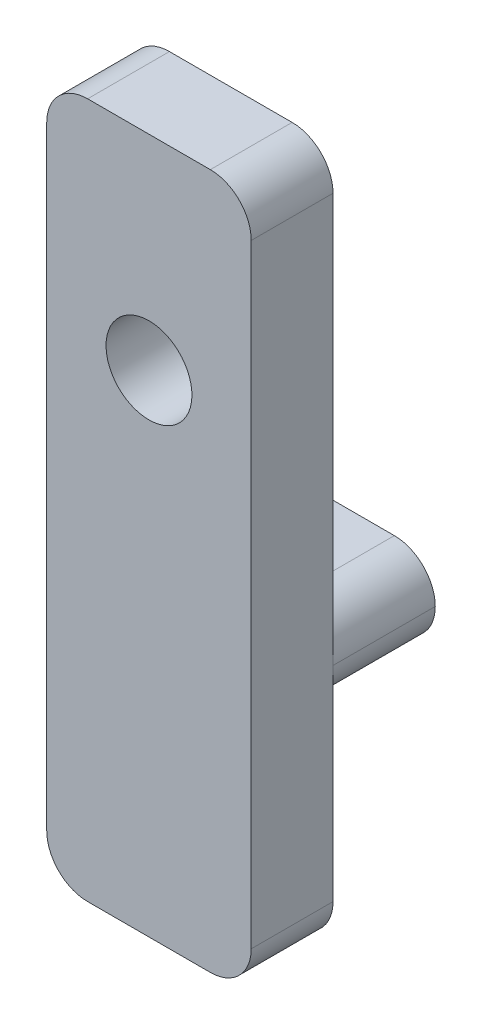
ISO-10303-21;
HEADER;
FILE_DESCRIPTION(('STEP AP214'),'2;1');
FILE_NAME('part.step','',(''),(''),'','','');
FILE_SCHEMA(('AUTOMOTIVE_DESIGN { 1 0 10303 214 1 1 1 1 }'));
ENDSEC;
DATA;
#1=APPLICATION_CONTEXT('core data for automotive mechanical design processes');
#2=APPLICATION_PROTOCOL_DEFINITION('international standard','automotive_design',2000,#1);
#3=PRODUCT_CONTEXT('',#1,'mechanical');
#4=PRODUCT('Part','Part','',(#3));
#5=PRODUCT_RELATED_PRODUCT_CATEGORY('part','',(#4));
#6=PRODUCT_DEFINITION_FORMATION('','',#4);
#7=PRODUCT_DEFINITION_CONTEXT('part definition',#1,'design');
#8=PRODUCT_DEFINITION('design','',#6,#7);
#9=PRODUCT_DEFINITION_SHAPE('','',#8);
#10=(LENGTH_UNIT() NAMED_UNIT(*) SI_UNIT(.MILLI.,.METRE.));
#11=(NAMED_UNIT(*) PLANE_ANGLE_UNIT() SI_UNIT($,.RADIAN.));
#12=(NAMED_UNIT(*) SI_UNIT($,.STERADIAN.) SOLID_ANGLE_UNIT());
#13=UNCERTAINTY_MEASURE_WITH_UNIT(LENGTH_MEASURE(1.E-05),#10,'distance_accuracy_value','');
#14=(GEOMETRIC_REPRESENTATION_CONTEXT(3) GLOBAL_UNCERTAINTY_ASSIGNED_CONTEXT((#13)) GLOBAL_UNIT_ASSIGNED_CONTEXT((#10,
#11,#12)) REPRESENTATION_CONTEXT('',''));
#15=CARTESIAN_POINT('',(0.,0.,0.));
#16=DIRECTION('',(0.,0.,1.));
#17=DIRECTION('',(1.,0.,0.));
#18=AXIS2_PLACEMENT_3D('',#15,#16,#17);
#19=CARTESIAN_POINT('',(5.,-10.,-4.));
#20=DIRECTION('',(0.,1.,0.));
#21=DIRECTION('',(0.,0.,1.));
#22=AXIS2_PLACEMENT_3D('',#19,#20,#21);
#23=PLANE('',#22);
#24=DIRECTION('',(-1.,0.,0.));
#25=VECTOR('',#24,1.);
#26=CARTESIAN_POINT('',(5.,-10.,0.));
#27=LINE('',#26,#25);
#28=CARTESIAN_POINT('',(3.,-10.,0.));
#29=VERTEX_POINT('',#28);
#30=CARTESIAN_POINT('',(-3.,-10.,0.));
#31=VERTEX_POINT('',#30);
#32=EDGE_CURVE('E164',#29,#31,#27,.T.);
#33=ORIENTED_EDGE('',*,*,#32,.T.);
#34=DIRECTION('',(0.,0.,-1.));
#35=VECTOR('',#34,1.);
#36=CARTESIAN_POINT('',(-3.,-10.,-4.));
#37=LINE('',#36,#35);
#38=CARTESIAN_POINT('',(-3.,-10.,-4.));
#39=VERTEX_POINT('',#38);
#40=EDGE_CURVE('E211',#31,#39,#37,.T.);
#41=ORIENTED_EDGE('',*,*,#40,.T.);
#42=DIRECTION('',(-1.,0.,0.));
#43=VECTOR('',#42,1.);
#44=CARTESIAN_POINT('',(5.,-10.,-4.));
#45=LINE('',#44,#43);
#46=CARTESIAN_POINT('',(3.,-10.,-4.));
#47=VERTEX_POINT('',#46);
#48=EDGE_CURVE('E168',#47,#39,#45,.T.);
#49=ORIENTED_EDGE('',*,*,#48,.F.);
#50=DIRECTION('',(0.,0.,-1.));
#51=VECTOR('',#50,1.);
#52=CARTESIAN_POINT('',(3.,-10.,-4.));
#53=LINE('',#52,#51);
#54=EDGE_CURVE('E209',#47,#29,#53,.F.);
#55=ORIENTED_EDGE('',*,*,#54,.T.);
#56=EDGE_LOOP('',(#33,#41,#49,#55));
#57=FACE_BOUND('',#56,.T.);
#58=ADVANCED_FACE('F35',(#57),#23,.F.);
#59=CARTESIAN_POINT('',(5.,0.,-4.));
#60=DIRECTION('',(0.,0.,1.));
#61=DIRECTION('',(0.,-1.,0.));
#62=AXIS2_PLACEMENT_3D('',#59,#60,#61);
#63=PLANE('',#62);
#64=ORIENTED_EDGE('',*,*,#48,.T.);
#65=CARTESIAN_POINT('',(-3.,-8.00000000000001,-4.));
#66=DIRECTION('',(0.,0.,1.));
#67=DIRECTION('',(0.,-1.,0.));
#68=AXIS2_PLACEMENT_3D('',#65,#66,#67);
#69=CIRCLE('',#68,2.);
#70=CARTESIAN_POINT('',(-5.,-8.00000000000001,-4.));
#71=VERTEX_POINT('',#70);
#72=EDGE_CURVE('E52',#39,#71,#69,.F.);
#73=ORIENTED_EDGE('',*,*,#72,.T.);
#74=DIRECTION('',(0.,1.,0.));
#75=VECTOR('',#74,1.);
#76=CARTESIAN_POINT('',(-5.,0.,-4.));
#77=LINE('',#76,#75);
#78=CARTESIAN_POINT('',(-5.,1.99999999999999,-4.));
#79=VERTEX_POINT('',#78);
#80=EDGE_CURVE('E222',#71,#79,#77,.T.);
#81=ORIENTED_EDGE('',*,*,#80,.T.);
#82=CARTESIAN_POINT('',(-3.,2.,-4.));
#83=DIRECTION('',(0.,0.,1.));
#84=DIRECTION('',(0.,-1.,0.));
#85=AXIS2_PLACEMENT_3D('',#82,#83,#84);
#86=CIRCLE('',#85,2.);
#87=CARTESIAN_POINT('',(-3.,0.,-4.));
#88=VERTEX_POINT('',#87);
#89=EDGE_CURVE('E215',#79,#88,#86,.T.);
#90=ORIENTED_EDGE('',*,*,#89,.T.);
#91=DIRECTION('',(-1.,0.,0.));
#92=VECTOR('',#91,1.);
#93=CARTESIAN_POINT('',(5.,0.,-4.));
#94=LINE('',#93,#92);
#95=CARTESIAN_POINT('',(3.,0.,-4.));
#96=VERTEX_POINT('',#95);
#97=EDGE_CURVE('E159',#96,#88,#94,.T.);
#98=ORIENTED_EDGE('',*,*,#97,.F.);
#99=CARTESIAN_POINT('',(3.,2.,-4.));
#100=DIRECTION('',(0.,0.,1.));
#101=DIRECTION('',(0.,-1.,0.));
#102=AXIS2_PLACEMENT_3D('',#99,#100,#101);
#103=CIRCLE('',#102,2.);
#104=CARTESIAN_POINT('',(5.,2.,-4.));
#105=VERTEX_POINT('',#104);
#106=EDGE_CURVE('E11',#96,#105,#103,.T.);
#107=ORIENTED_EDGE('',*,*,#106,.T.);
#108=DIRECTION('',(0.,1.,0.));
#109=VECTOR('',#108,1.);
#110=CARTESIAN_POINT('',(5.,0.,-4.));
#111=LINE('',#110,#109);
#112=CARTESIAN_POINT('',(5.,-8.00000000000001,-4.));
#113=VERTEX_POINT('',#112);
#114=EDGE_CURVE('E243',#113,#105,#111,.T.);
#115=ORIENTED_EDGE('',*,*,#114,.F.);
#116=CARTESIAN_POINT('',(3.,-8.00000000000001,-4.));
#117=DIRECTION('',(0.,0.,1.));
#118=DIRECTION('',(0.,-1.,0.));
#119=AXIS2_PLACEMENT_3D('',#116,#117,#118);
#120=CIRCLE('',#119,2.);
#121=EDGE_CURVE('E60',#113,#47,#120,.F.);
#122=ORIENTED_EDGE('',*,*,#121,.T.);
#123=EDGE_LOOP('',(#64,#73,#81,#90,#98,#107,#115,#122));
#124=FACE_BOUND('',#123,.T.);
#125=ADVANCED_FACE('F264',(#124),#63,.F.);
#126=CARTESIAN_POINT('',(5.,0.,-9.00000000000001));
#127=DIRECTION('',(0.,1.,0.));
#128=DIRECTION('',(0.,0.,1.));
#129=AXIS2_PLACEMENT_3D('',#126,#127,#128);
#130=PLANE('',#129);
#131=ORIENTED_EDGE('',*,*,#97,.T.);
#132=DIRECTION('',(0.,0.,-1.));
#133=VECTOR('',#132,1.);
#134=CARTESIAN_POINT('',(-3.,0.,-9.00000000000001));
#135=LINE('',#134,#133);
#136=CARTESIAN_POINT('',(-3.,0.,-9.00000000000001));
#137=VERTEX_POINT('',#136);
#138=EDGE_CURVE('E150',#88,#137,#135,.T.);
#139=ORIENTED_EDGE('',*,*,#138,.T.);
#140=DIRECTION('',(-1.,0.,0.));
#141=VECTOR('',#140,1.);
#142=CARTESIAN_POINT('',(5.,0.,-9.00000000000001));
#143=LINE('',#142,#141);
#144=CARTESIAN_POINT('',(3.,0.,-9.00000000000001));
#145=VERTEX_POINT('',#144);
#146=EDGE_CURVE('E143',#145,#137,#143,.T.);
#147=ORIENTED_EDGE('',*,*,#146,.F.);
#148=DIRECTION('',(0.,0.,-1.));
#149=VECTOR('',#148,1.);
#150=CARTESIAN_POINT('',(3.,0.,-9.00000000000001));
#151=LINE('',#150,#149);
#152=EDGE_CURVE('E156',#145,#96,#151,.F.);
#153=ORIENTED_EDGE('',*,*,#152,.T.);
#154=EDGE_LOOP('',(#131,#139,#147,#153));
#155=FACE_BOUND('',#154,.T.);
#156=ADVANCED_FACE('F155',(#155),#130,.F.);
#157=CARTESIAN_POINT('',(5.,4.,-9.));
#158=DIRECTION('',(0.,0.,1.));
#159=DIRECTION('',(0.,-1.,0.));
#160=AXIS2_PLACEMENT_3D('',#157,#158,#159);
#161=PLANE('',#160);
#162=ORIENTED_EDGE('',*,*,#146,.T.);
#163=CARTESIAN_POINT('',(-3.,2.,-9.00000000000001));
#164=DIRECTION('',(0.,0.,1.));
#165=DIRECTION('',(0.,-1.,0.));
#166=AXIS2_PLACEMENT_3D('',#163,#164,#165);
#167=CIRCLE('',#166,2.);
#168=CARTESIAN_POINT('',(-5.,2.,-9.00000000000001));
#169=VERTEX_POINT('',#168);
#170=EDGE_CURVE('E175',#137,#169,#167,.F.);
#171=ORIENTED_EDGE('',*,*,#170,.T.);
#172=CARTESIAN_POINT('',(-3.,2.,-9.00000000000001));
#173=DIRECTION('',(0.,0.,1.));
#174=DIRECTION('',(0.,-1.,0.));
#175=AXIS2_PLACEMENT_3D('',#172,#173,#174);
#176=CIRCLE('',#175,2.);
#177=CARTESIAN_POINT('',(-3.,4.,-9.));
#178=VERTEX_POINT('',#177);
#179=EDGE_CURVE('E173',#169,#178,#176,.F.);
#180=ORIENTED_EDGE('',*,*,#179,.T.);
#181=DIRECTION('',(-1.,0.,0.));
#182=VECTOR('',#181,1.);
#183=CARTESIAN_POINT('',(5.,4.,-9.));
#184=LINE('',#183,#182);
#185=CARTESIAN_POINT('',(3.,4.,-9.));
#186=VERTEX_POINT('',#185);
#187=EDGE_CURVE('E160',#186,#178,#184,.T.);
#188=ORIENTED_EDGE('',*,*,#187,.F.);
#189=CARTESIAN_POINT('',(3.,2.,-9.00000000000001));
#190=DIRECTION('',(0.,0.,1.));
#191=DIRECTION('',(0.,-1.,0.));
#192=AXIS2_PLACEMENT_3D('',#189,#190,#191);
#193=CIRCLE('',#192,2.);
#194=CARTESIAN_POINT('',(5.,2.,-9.00000000000001));
#195=VERTEX_POINT('',#194);
#196=EDGE_CURVE('E145',#186,#195,#193,.F.);
#197=ORIENTED_EDGE('',*,*,#196,.T.);
#198=CARTESIAN_POINT('',(3.,2.,-9.00000000000001));
#199=DIRECTION('',(0.,0.,1.));
#200=DIRECTION('',(0.,-1.,0.));
#201=AXIS2_PLACEMENT_3D('',#198,#199,#200);
#202=CIRCLE('',#201,2.);
#203=EDGE_CURVE('E140',#195,#145,#202,.F.);
#204=ORIENTED_EDGE('',*,*,#203,.T.);
#205=EDGE_LOOP('',(#162,#171,#180,#188,#197,#204));
#206=FACE_BOUND('',#205,.T.);
#207=ADVANCED_FACE('F142',(#206),#161,.F.);
#208=CARTESIAN_POINT('',(5.,4.,-4.));
#209=DIRECTION('',(0.,-1.,0.));
#210=DIRECTION('',(0.,0.,-1.));
#211=AXIS2_PLACEMENT_3D('',#208,#209,#210);
#212=PLANE('',#211);
#213=ORIENTED_EDGE('',*,*,#187,.T.);
#214=DIRECTION('',(0.,0.,1.));
#215=VECTOR('',#214,1.);
#216=CARTESIAN_POINT('',(-3.,4.,-4.));
#217=LINE('',#216,#215);
#218=CARTESIAN_POINT('',(-3.,4.,-4.));
#219=VERTEX_POINT('',#218);
#220=EDGE_CURVE('E184',#178,#219,#217,.T.);
#221=ORIENTED_EDGE('',*,*,#220,.T.);
#222=DIRECTION('',(-1.,0.,0.));
#223=VECTOR('',#222,1.);
#224=CARTESIAN_POINT('',(5.,4.,-4.));
#225=LINE('',#224,#223);
#226=CARTESIAN_POINT('',(3.,4.,-4.));
#227=VERTEX_POINT('',#226);
#228=EDGE_CURVE('E259',#227,#219,#225,.T.);
#229=ORIENTED_EDGE('',*,*,#228,.F.);
#230=DIRECTION('',(0.,0.,1.));
#231=VECTOR('',#230,1.);
#232=CARTESIAN_POINT('',(3.,4.,-4.));
#233=LINE('',#232,#231);
#234=EDGE_CURVE('E181',#227,#186,#233,.F.);
#235=ORIENTED_EDGE('',*,*,#234,.T.);
#236=EDGE_LOOP('',(#213,#221,#229,#235));
#237=FACE_BOUND('',#236,.T.);
#238=ADVANCED_FACE('F354',(#237),#212,.F.);
#239=CARTESIAN_POINT('',(5.,24.,-3.99999999999999));
#240=DIRECTION('',(0.,0.,1.));
#241=DIRECTION('',(0.,-1.,0.));
#242=AXIS2_PLACEMENT_3D('',#239,#240,#241);
#243=PLANE('',#242);
#244=CARTESIAN_POINT('',(0.,14.,-4.));
#245=DIRECTION('',(0.,0.,-1.));
#246=DIRECTION('',(0.,1.,0.));
#247=AXIS2_PLACEMENT_3D('',#244,#245,#246);
#248=CIRCLE('',#247,2.1);
#249=CARTESIAN_POINT('',(0.,16.1,-4.));
#250=VERTEX_POINT('',#249);
#251=EDGE_CURVE('E233',#250,#250,#248,.T.);
#252=ORIENTED_EDGE('',*,*,#251,.F.);
#253=EDGE_LOOP('',(#252));
#254=FACE_BOUND('',#253,.T.);
#255=DIRECTION('',(-1.,0.,0.));
#256=VECTOR('',#255,1.);
#257=CARTESIAN_POINT('',(5.,24.,-3.99999999999999));
#258=LINE('',#257,#256);
#259=CARTESIAN_POINT('',(3.,24.,-3.99999999999999));
#260=VERTEX_POINT('',#259);
#261=CARTESIAN_POINT('',(-3.,24.,-3.99999999999999));
#262=VERTEX_POINT('',#261);
#263=EDGE_CURVE('E256',#260,#262,#258,.T.);
#264=ORIENTED_EDGE('',*,*,#263,.F.);
#265=CARTESIAN_POINT('',(3.,22.,-4.));
#266=DIRECTION('',(0.,0.,1.));
#267=DIRECTION('',(0.,-1.,0.));
#268=AXIS2_PLACEMENT_3D('',#265,#266,#267);
#269=CIRCLE('',#268,2.);
#270=CARTESIAN_POINT('',(5.,22.,-4.));
#271=VERTEX_POINT('',#270);
#272=EDGE_CURVE('E207',#260,#271,#269,.F.);
#273=ORIENTED_EDGE('',*,*,#272,.T.);
#274=DIRECTION('',(0.,1.,0.));
#275=VECTOR('',#274,1.);
#276=CARTESIAN_POINT('',(5.,24.,-3.99999999999999));
#277=LINE('',#276,#275);
#278=EDGE_CURVE('E246',#105,#271,#277,.T.);
#279=ORIENTED_EDGE('',*,*,#278,.F.);
#280=CARTESIAN_POINT('',(3.,2.,-4.));
#281=DIRECTION('',(0.,0.,1.));
#282=DIRECTION('',(0.,-1.,0.));
#283=AXIS2_PLACEMENT_3D('',#280,#281,#282);
#284=CIRCLE('',#283,2.);
#285=EDGE_CURVE('E44',#105,#227,#284,.T.);
#286=ORIENTED_EDGE('',*,*,#285,.T.);
#287=ORIENTED_EDGE('',*,*,#228,.T.);
#288=CARTESIAN_POINT('',(-3.,2.,-4.));
#289=DIRECTION('',(0.,0.,1.));
#290=DIRECTION('',(0.,-1.,0.));
#291=AXIS2_PLACEMENT_3D('',#288,#289,#290);
#292=CIRCLE('',#291,2.);
#293=EDGE_CURVE('E217',#219,#79,#292,.T.);
#294=ORIENTED_EDGE('',*,*,#293,.T.);
#295=DIRECTION('',(0.,1.,0.));
#296=VECTOR('',#295,1.);
#297=CARTESIAN_POINT('',(-5.,24.,-3.99999999999999));
#298=LINE('',#297,#296);
#299=CARTESIAN_POINT('',(-5.,22.,-4.));
#300=VERTEX_POINT('',#299);
#301=EDGE_CURVE('E227',#79,#300,#298,.T.);
#302=ORIENTED_EDGE('',*,*,#301,.T.);
#303=CARTESIAN_POINT('',(-3.,22.,-4.));
#304=DIRECTION('',(0.,0.,1.));
#305=DIRECTION('',(0.,-1.,0.));
#306=AXIS2_PLACEMENT_3D('',#303,#304,#305);
#307=CIRCLE('',#306,2.);
#308=EDGE_CURVE('E205',#300,#262,#307,.F.);
#309=ORIENTED_EDGE('',*,*,#308,.T.);
#310=EDGE_LOOP('',(#264,#273,#279,#286,#287,#294,#302,#309));
#311=FACE_BOUND('',#310,.T.);
#312=ADVANCED_FACE('F350',(#254,#311),#243,.F.);
#313=CARTESIAN_POINT('',(5.,24.,0.));
#314=DIRECTION('',(0.,-1.,0.));
#315=DIRECTION('',(0.,0.,-1.));
#316=AXIS2_PLACEMENT_3D('',#313,#314,#315);
#317=PLANE('',#316);
#318=DIRECTION('',(-1.,0.,0.));
#319=VECTOR('',#318,1.);
#320=CARTESIAN_POINT('',(5.,24.,0.));
#321=LINE('',#320,#319);
#322=CARTESIAN_POINT('',(3.,24.,0.));
#323=VERTEX_POINT('',#322);
#324=CARTESIAN_POINT('',(-3.,24.,0.));
#325=VERTEX_POINT('',#324);
#326=EDGE_CURVE('E248',#323,#325,#321,.T.);
#327=ORIENTED_EDGE('',*,*,#326,.F.);
#328=DIRECTION('',(0.,0.,1.));
#329=VECTOR('',#328,1.);
#330=CARTESIAN_POINT('',(3.,24.,0.));
#331=LINE('',#330,#329);
#332=EDGE_CURVE('E203',#323,#260,#331,.F.);
#333=ORIENTED_EDGE('',*,*,#332,.T.);
#334=ORIENTED_EDGE('',*,*,#263,.T.);
#335=DIRECTION('',(0.,0.,1.));
#336=VECTOR('',#335,1.);
#337=CARTESIAN_POINT('',(-3.,24.,0.));
#338=LINE('',#337,#336);
#339=EDGE_CURVE('E200',#262,#325,#338,.T.);
#340=ORIENTED_EDGE('',*,*,#339,.T.);
#341=EDGE_LOOP('',(#327,#333,#334,#340));
#342=FACE_BOUND('',#341,.T.);
#343=ADVANCED_FACE('F285',(#342),#317,.F.);
#344=CARTESIAN_POINT('',(5.,0.,0.));
#345=DIRECTION('',(0.,0.,-1.));
#346=DIRECTION('',(0.,1.,0.));
#347=AXIS2_PLACEMENT_3D('',#344,#345,#346);
#348=PLANE('',#347);
#349=CARTESIAN_POINT('',(0.,14.,0.));
#350=DIRECTION('',(0.,0.,-1.));
#351=DIRECTION('',(0.,1.,0.));
#352=AXIS2_PLACEMENT_3D('',#349,#350,#351);
#353=CIRCLE('',#352,2.1);
#354=CARTESIAN_POINT('',(0.,16.1,0.));
#355=VERTEX_POINT('',#354);
#356=EDGE_CURVE('E229',#355,#355,#353,.T.);
#357=ORIENTED_EDGE('',*,*,#356,.T.);
#358=EDGE_LOOP('',(#357));
#359=FACE_BOUND('',#358,.T.);
#360=DIRECTION('',(0.,-1.,0.));
#361=VECTOR('',#360,1.);
#362=CARTESIAN_POINT('',(5.,-10.,0.));
#363=LINE('',#362,#361);
#364=CARTESIAN_POINT('',(5.,22.,0.));
#365=VERTEX_POINT('',#364);
#366=CARTESIAN_POINT('',(5.,-8.00000000000001,0.));
#367=VERTEX_POINT('',#366);
#368=EDGE_CURVE('E240',#365,#367,#363,.T.);
#369=ORIENTED_EDGE('',*,*,#368,.F.);
#370=CARTESIAN_POINT('',(3.,22.,0.));
#371=DIRECTION('',(0.,0.,-1.));
#372=DIRECTION('',(0.,1.,0.));
#373=AXIS2_PLACEMENT_3D('',#370,#371,#372);
#374=CIRCLE('',#373,2.);
#375=EDGE_CURVE('E198',#365,#323,#374,.F.);
#376=ORIENTED_EDGE('',*,*,#375,.T.);
#377=ORIENTED_EDGE('',*,*,#326,.T.);
#378=CARTESIAN_POINT('',(-3.,22.,0.));
#379=DIRECTION('',(0.,0.,-1.));
#380=DIRECTION('',(0.,1.,0.));
#381=AXIS2_PLACEMENT_3D('',#378,#379,#380);
#382=CIRCLE('',#381,2.);
#383=CARTESIAN_POINT('',(-5.,22.,0.));
#384=VERTEX_POINT('',#383);
#385=EDGE_CURVE('E196',#325,#384,#382,.F.);
#386=ORIENTED_EDGE('',*,*,#385,.T.);
#387=DIRECTION('',(0.,-1.,0.));
#388=VECTOR('',#387,1.);
#389=CARTESIAN_POINT('',(-5.,0.,0.));
#390=LINE('',#389,#388);
#391=CARTESIAN_POINT('',(-5.,-8.00000000000001,0.));
#392=VERTEX_POINT('',#391);
#393=EDGE_CURVE('E244',#384,#392,#390,.T.);
#394=ORIENTED_EDGE('',*,*,#393,.T.);
#395=CARTESIAN_POINT('',(-3.,-8.00000000000001,0.));
#396=DIRECTION('',(0.,0.,-1.));
#397=DIRECTION('',(0.,1.,0.));
#398=AXIS2_PLACEMENT_3D('',#395,#396,#397);
#399=CIRCLE('',#398,2.);
#400=EDGE_CURVE('E194',#392,#31,#399,.F.);
#401=ORIENTED_EDGE('',*,*,#400,.T.);
#402=ORIENTED_EDGE('',*,*,#32,.F.);
#403=CARTESIAN_POINT('',(3.,-8.00000000000001,0.));
#404=DIRECTION('',(0.,0.,-1.));
#405=DIRECTION('',(0.,1.,0.));
#406=AXIS2_PLACEMENT_3D('',#403,#404,#405);
#407=CIRCLE('',#406,2.);
#408=EDGE_CURVE('E192',#29,#367,#407,.F.);
#409=ORIENTED_EDGE('',*,*,#408,.T.);
#410=EDGE_LOOP('',(#369,#376,#377,#386,#394,#401,#402,#409));
#411=FACE_BOUND('',#410,.T.);
#412=ADVANCED_FACE('F274',(#359,#411),#348,.F.);
#413=CARTESIAN_POINT('',(5.,0.,0.));
#414=DIRECTION('',(-1.,0.,0.));
#415=DIRECTION('',(0.,0.,1.));
#416=AXIS2_PLACEMENT_3D('',#413,#414,#415);
#417=PLANE('',#416);
#418=ORIENTED_EDGE('',*,*,#114,.T.);
#419=ORIENTED_EDGE('',*,*,#278,.T.);
#420=DIRECTION('',(0.,0.,1.));
#421=VECTOR('',#420,1.);
#422=CARTESIAN_POINT('',(5.,22.,0.));
#423=LINE('',#422,#421);
#424=EDGE_CURVE('E189',#271,#365,#423,.T.);
#425=ORIENTED_EDGE('',*,*,#424,.T.);
#426=ORIENTED_EDGE('',*,*,#368,.T.);
#427=DIRECTION('',(0.,0.,-1.));
#428=VECTOR('',#427,1.);
#429=CARTESIAN_POINT('',(5.,-8.00000000000001,0.));
#430=LINE('',#429,#428);
#431=EDGE_CURVE('E186',#367,#113,#430,.T.);
#432=ORIENTED_EDGE('',*,*,#431,.T.);
#433=EDGE_LOOP('',(#418,#419,#425,#426,#432));
#434=FACE_BOUND('',#433,.T.);
#435=ADVANCED_FACE('F276',(#434),#417,.F.);
#436=CARTESIAN_POINT('',(-5.,0.,0.));
#437=DIRECTION('',(-1.,0.,0.));
#438=DIRECTION('',(0.,0.,1.));
#439=AXIS2_PLACEMENT_3D('',#436,#437,#438);
#440=PLANE('',#439);
#441=ORIENTED_EDGE('',*,*,#301,.F.);
#442=ORIENTED_EDGE('',*,*,#80,.F.);
#443=DIRECTION('',(0.,0.,-1.));
#444=VECTOR('',#443,1.);
#445=CARTESIAN_POINT('',(-5.,-8.00000000000001,0.));
#446=LINE('',#445,#444);
#447=EDGE_CURVE('E177',#71,#392,#446,.F.);
#448=ORIENTED_EDGE('',*,*,#447,.T.);
#449=ORIENTED_EDGE('',*,*,#393,.F.);
#450=DIRECTION('',(0.,0.,1.));
#451=VECTOR('',#450,1.);
#452=CARTESIAN_POINT('',(-5.,22.,-3.99999999999999));
#453=LINE('',#452,#451);
#454=EDGE_CURVE('E179',#384,#300,#453,.F.);
#455=ORIENTED_EDGE('',*,*,#454,.T.);
#456=EDGE_LOOP('',(#441,#442,#448,#449,#455));
#457=FACE_BOUND('',#456,.T.);
#458=ADVANCED_FACE('F295',(#457),#440,.T.);
#459=CARTESIAN_POINT('',(-3.,2.,-4.));
#460=DIRECTION('',(0.,0.,-1.));
#461=DIRECTION('',(-1.,0.,0.));
#462=AXIS2_PLACEMENT_3D('',#459,#460,#461);
#463=CYLINDRICAL_SURFACE('',#462,2.);
#464=DIRECTION('',(0.,0.,1.));
#465=VECTOR('',#464,1.);
#466=CARTESIAN_POINT('',(-5.,2.,-9.));
#467=LINE('',#466,#465);
#468=EDGE_CURVE('E220',#79,#169,#467,.F.);
#469=ORIENTED_EDGE('',*,*,#468,.F.);
#470=ORIENTED_EDGE('',*,*,#293,.F.);
#471=ORIENTED_EDGE('',*,*,#220,.F.);
#472=ORIENTED_EDGE('',*,*,#179,.F.);
#473=EDGE_LOOP('',(#469,#470,#471,#472));
#474=FACE_BOUND('',#473,.T.);
#475=ADVANCED_FACE('F315',(#474),#463,.T.);
#476=CARTESIAN_POINT('',(-3.,2.,-9.00000000000001));
#477=DIRECTION('',(0.,0.,1.));
#478=DIRECTION('',(0.,-1.,0.));
#479=AXIS2_PLACEMENT_3D('',#476,#477,#478);
#480=CYLINDRICAL_SURFACE('',#479,2.);
#481=ORIENTED_EDGE('',*,*,#89,.F.);
#482=ORIENTED_EDGE('',*,*,#468,.T.);
#483=ORIENTED_EDGE('',*,*,#170,.F.);
#484=ORIENTED_EDGE('',*,*,#138,.F.);
#485=EDGE_LOOP('',(#481,#482,#483,#484));
#486=FACE_BOUND('',#485,.T.);
#487=ADVANCED_FACE('F312',(#486),#480,.T.);
#488=CARTESIAN_POINT('',(3.,2.,0.));
#489=DIRECTION('',(0.,0.,-1.));
#490=DIRECTION('',(0.,1.,0.));
#491=AXIS2_PLACEMENT_3D('',#488,#489,#490);
#492=CYLINDRICAL_SURFACE('',#491,2.);
#493=ORIENTED_EDGE('',*,*,#152,.F.);
#494=ORIENTED_EDGE('',*,*,#203,.F.);
#495=DIRECTION('',(0.,0.,-1.));
#496=VECTOR('',#495,1.);
#497=CARTESIAN_POINT('',(5.,2.,0.));
#498=LINE('',#497,#496);
#499=EDGE_CURVE('E39',#105,#195,#498,.T.);
#500=ORIENTED_EDGE('',*,*,#499,.F.);
#501=ORIENTED_EDGE('',*,*,#106,.F.);
#502=EDGE_LOOP('',(#493,#494,#500,#501));
#503=FACE_BOUND('',#502,.T.);
#504=ADVANCED_FACE('F163',(#503),#492,.T.);
#505=CARTESIAN_POINT('',(3.,2.,0.));
#506=DIRECTION('',(0.,0.,1.));
#507=DIRECTION('',(1.,0.,0.));
#508=AXIS2_PLACEMENT_3D('',#505,#506,#507);
#509=CYLINDRICAL_SURFACE('',#508,2.);
#510=ORIENTED_EDGE('',*,*,#196,.F.);
#511=ORIENTED_EDGE('',*,*,#234,.F.);
#512=ORIENTED_EDGE('',*,*,#285,.F.);
#513=ORIENTED_EDGE('',*,*,#499,.T.);
#514=EDGE_LOOP('',(#510,#511,#512,#513));
#515=FACE_BOUND('',#514,.T.);
#516=ADVANCED_FACE('F319',(#515),#509,.T.);
#517=CARTESIAN_POINT('',(3.,22.,0.));
#518=DIRECTION('',(0.,0.,1.));
#519=DIRECTION('',(1.,0.,0.));
#520=AXIS2_PLACEMENT_3D('',#517,#518,#519);
#521=CYLINDRICAL_SURFACE('',#520,2.);
#522=ORIENTED_EDGE('',*,*,#272,.F.);
#523=ORIENTED_EDGE('',*,*,#332,.F.);
#524=ORIENTED_EDGE('',*,*,#375,.F.);
#525=ORIENTED_EDGE('',*,*,#424,.F.);
#526=EDGE_LOOP('',(#522,#523,#524,#525));
#527=FACE_BOUND('',#526,.T.);
#528=ADVANCED_FACE('F281',(#527),#521,.T.);
#529=CARTESIAN_POINT('',(-3.,22.,0.));
#530=DIRECTION('',(0.,0.,-1.));
#531=DIRECTION('',(-1.,0.,0.));
#532=AXIS2_PLACEMENT_3D('',#529,#530,#531);
#533=CYLINDRICAL_SURFACE('',#532,2.);
#534=ORIENTED_EDGE('',*,*,#308,.F.);
#535=ORIENTED_EDGE('',*,*,#454,.F.);
#536=ORIENTED_EDGE('',*,*,#385,.F.);
#537=ORIENTED_EDGE('',*,*,#339,.F.);
#538=EDGE_LOOP('',(#534,#535,#536,#537));
#539=FACE_BOUND('',#538,.T.);
#540=ADVANCED_FACE('F290',(#539),#533,.T.);
#541=CARTESIAN_POINT('',(-3.,-8.00000000000001,-4.));
#542=DIRECTION('',(0.,0.,1.));
#543=DIRECTION('',(1.,0.,0.));
#544=AXIS2_PLACEMENT_3D('',#541,#542,#543);
#545=CYLINDRICAL_SURFACE('',#544,2.);
#546=ORIENTED_EDGE('',*,*,#400,.F.);
#547=ORIENTED_EDGE('',*,*,#447,.F.);
#548=ORIENTED_EDGE('',*,*,#72,.F.);
#549=ORIENTED_EDGE('',*,*,#40,.F.);
#550=EDGE_LOOP('',(#546,#547,#548,#549));
#551=FACE_BOUND('',#550,.T.);
#552=ADVANCED_FACE('F296',(#551),#545,.T.);
#553=CARTESIAN_POINT('',(3.,-8.00000000000001,0.));
#554=DIRECTION('',(0.,0.,-1.));
#555=DIRECTION('',(-1.,0.,0.));
#556=AXIS2_PLACEMENT_3D('',#553,#554,#555);
#557=CYLINDRICAL_SURFACE('',#556,2.);
#558=ORIENTED_EDGE('',*,*,#408,.F.);
#559=ORIENTED_EDGE('',*,*,#54,.F.);
#560=ORIENTED_EDGE('',*,*,#121,.F.);
#561=ORIENTED_EDGE('',*,*,#431,.F.);
#562=EDGE_LOOP('',(#558,#559,#560,#561));
#563=FACE_BOUND('',#562,.T.);
#564=ADVANCED_FACE('F37',(#563),#557,.T.);
#565=CARTESIAN_POINT('',(0.,14.,0.));
#566=DIRECTION('',(0.,0.,-1.));
#567=DIRECTION('',(0.,1.,0.));
#568=AXIS2_PLACEMENT_3D('',#565,#566,#567);
#569=CYLINDRICAL_SURFACE('',#568,2.1);
#570=ORIENTED_EDGE('',*,*,#356,.F.);
#571=EDGE_LOOP('',(#570));
#572=FACE_BOUND('',#571,.T.);
#573=ORIENTED_EDGE('',*,*,#251,.T.);
#574=EDGE_LOOP('',(#573));
#575=FACE_BOUND('',#574,.T.);
#576=ADVANCED_FACE('F302',(#572,#575),#569,.F.);
#577=CLOSED_SHELL('',(#58,#125,#156,#207,#238,#312,#343,#412,#435,#458,#475,#487,#504,#516,#528,
#540,#552,#564,#576));
#578=MANIFOLD_SOLID_BREP('B2',#577);
#579=ADVANCED_BREP_SHAPE_REPRESENTATION('',(#18,#578),#14);
#580=SHAPE_DEFINITION_REPRESENTATION(#9,#579);
ENDSEC;
END-ISO-10303-21;
